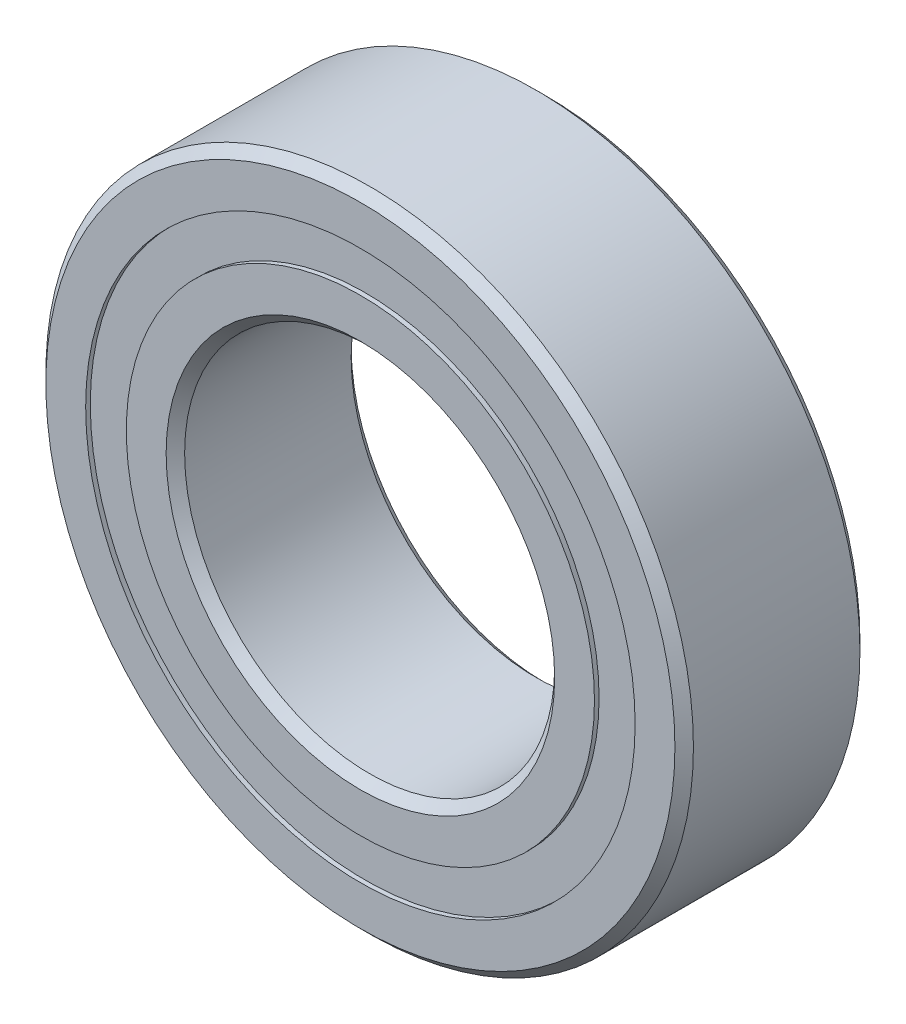
ISO-10303-21;
HEADER;
FILE_DESCRIPTION(('STEP AP214'),'2;1');
FILE_NAME('part.step','',(''),(''),'','','');
FILE_SCHEMA(('AUTOMOTIVE_DESIGN { 1 0 10303 214 1 1 1 1 }'));
ENDSEC;
DATA;
#1=APPLICATION_CONTEXT('core data for automotive mechanical design processes');
#2=APPLICATION_PROTOCOL_DEFINITION('international standard','automotive_design',2000,#1);
#3=PRODUCT_CONTEXT('',#1,'mechanical');
#4=PRODUCT('Part','Part','',(#3));
#5=PRODUCT_RELATED_PRODUCT_CATEGORY('part','',(#4));
#6=PRODUCT_DEFINITION_FORMATION('','',#4);
#7=PRODUCT_DEFINITION_CONTEXT('part definition',#1,'design');
#8=PRODUCT_DEFINITION('design','',#6,#7);
#9=PRODUCT_DEFINITION_SHAPE('','',#8);
#10=(LENGTH_UNIT() NAMED_UNIT(*) SI_UNIT(.MILLI.,.METRE.));
#11=(NAMED_UNIT(*) PLANE_ANGLE_UNIT() SI_UNIT($,.RADIAN.));
#12=(NAMED_UNIT(*) SI_UNIT($,.STERADIAN.) SOLID_ANGLE_UNIT());
#13=UNCERTAINTY_MEASURE_WITH_UNIT(LENGTH_MEASURE(1.E-05),#10,'distance_accuracy_value','');
#14=(GEOMETRIC_REPRESENTATION_CONTEXT(3) GLOBAL_UNCERTAINTY_ASSIGNED_CONTEXT((#13)) GLOBAL_UNIT_ASSIGNED_CONTEXT((#10,
#11,#12)) REPRESENTATION_CONTEXT('',''));
#15=CARTESIAN_POINT('',(0.,0.,0.));
#16=DIRECTION('',(0.,0.,1.));
#17=DIRECTION('',(1.,0.,0.));
#18=AXIS2_PLACEMENT_3D('',#15,#16,#17);
#19=CARTESIAN_POINT('',(0.,5.93956043956044,-1.9));
#20=DIRECTION('',(0.,0.,1.));
#21=DIRECTION('',(1.,0.,0.));
#22=AXIS2_PLACEMENT_3D('',#19,#20,#21);
#23=PLANE('',#22);
#24=CARTESIAN_POINT('',(0.,0.,-1.9));
#25=DIRECTION('',(0.,0.,1.));
#26=DIRECTION('',(1.,0.,0.));
#27=AXIS2_PLACEMENT_3D('',#24,#25,#26);
#28=CIRCLE('',#27,5.93956043956044);
#29=CARTESIAN_POINT('',(5.93956043956044,0.,-1.9));
#30=VERTEX_POINT('',#29);
#31=EDGE_CURVE('E57',#30,#30,#28,.T.);
#32=ORIENTED_EDGE('',*,*,#31,.F.);
#33=EDGE_LOOP('',(#32));
#34=FACE_BOUND('',#33,.T.);
#35=CARTESIAN_POINT('',(0.,0.,-1.9));
#36=DIRECTION('',(0.,0.,1.));
#37=DIRECTION('',(1.,0.,0.));
#38=AXIS2_PLACEMENT_3D('',#35,#36,#37);
#39=CIRCLE('',#38,5.06043956043956);
#40=CARTESIAN_POINT('',(5.06043956043956,0.,-1.9));
#41=VERTEX_POINT('',#40);
#42=EDGE_CURVE('E11',#41,#41,#39,.T.);
#43=ORIENTED_EDGE('',*,*,#42,.T.);
#44=EDGE_LOOP('',(#43));
#45=FACE_BOUND('',#44,.T.);
#46=ADVANCED_FACE('F43',(#34,#45),#23,.F.);
#47=CARTESIAN_POINT('',(0.,0.,2.));
#48=DIRECTION('',(0.,0.,1.));
#49=DIRECTION('',(1.,0.,0.));
#50=AXIS2_PLACEMENT_3D('',#47,#48,#49);
#51=CYLINDRICAL_SURFACE('',#50,5.06043956043956);
#52=ORIENTED_EDGE('',*,*,#42,.F.);
#53=EDGE_LOOP('',(#52));
#54=FACE_BOUND('',#53,.T.);
#55=CARTESIAN_POINT('',(0.,0.,-0.991633418565898));
#56=DIRECTION('',(0.,0.,1.));
#57=DIRECTION('',(1.,0.,0.));
#58=AXIS2_PLACEMENT_3D('',#55,#56,#57);
#59=CIRCLE('',#58,5.06043956043956);
#60=CARTESIAN_POINT('',(5.06043956043956,0.,-0.991633418565898));
#61=VERTEX_POINT('',#60);
#62=EDGE_CURVE('E49',#61,#61,#59,.T.);
#63=ORIENTED_EDGE('',*,*,#62,.T.);
#64=EDGE_LOOP('',(#63));
#65=FACE_BOUND('',#64,.T.);
#66=ADVANCED_FACE('F66',(#54,#65),#51,.F.);
#67=CARTESIAN_POINT('',(0.,5.93956043956044,-0.991633418565898));
#68=DIRECTION('',(0.,0.,-1.));
#69=DIRECTION('',(-1.,0.,0.));
#70=AXIS2_PLACEMENT_3D('',#67,#68,#69);
#71=PLANE('',#70);
#72=ORIENTED_EDGE('',*,*,#62,.F.);
#73=EDGE_LOOP('',(#72));
#74=FACE_BOUND('',#73,.T.);
#75=CARTESIAN_POINT('',(0.,0.,-0.991633418565898));
#76=DIRECTION('',(0.,0.,1.));
#77=DIRECTION('',(1.,0.,0.));
#78=AXIS2_PLACEMENT_3D('',#75,#76,#77);
#79=CIRCLE('',#78,5.93956043956044);
#80=CARTESIAN_POINT('',(5.93956043956044,0.,-0.991633418565898));
#81=VERTEX_POINT('',#80);
#82=EDGE_CURVE('E53',#81,#81,#79,.T.);
#83=ORIENTED_EDGE('',*,*,#82,.T.);
#84=EDGE_LOOP('',(#83));
#85=FACE_BOUND('',#84,.T.);
#86=ADVANCED_FACE('F70',(#74,#85),#71,.F.);
#87=CARTESIAN_POINT('',(0.,0.,2.));
#88=DIRECTION('',(0.,0.,1.));
#89=DIRECTION('',(1.,0.,0.));
#90=AXIS2_PLACEMENT_3D('',#87,#88,#89);
#91=CYLINDRICAL_SURFACE('',#90,5.93956043956044);
#92=ORIENTED_EDGE('',*,*,#82,.F.);
#93=EDGE_LOOP('',(#92));
#94=FACE_BOUND('',#93,.T.);
#95=ORIENTED_EDGE('',*,*,#31,.T.);
#96=EDGE_LOOP('',(#95));
#97=FACE_BOUND('',#96,.T.);
#98=ADVANCED_FACE('F63',(#94,#97),#91,.T.);
#99=CLOSED_SHELL('',(#46,#66,#86,#98));
#100=MANIFOLD_SOLID_BREP('B2',#99);
#101=CARTESIAN_POINT('',(0.,5.93956043956044,1.9));
#102=DIRECTION('',(0.,0.,-1.));
#103=DIRECTION('',(-1.,0.,0.));
#104=AXIS2_PLACEMENT_3D('',#101,#102,#103);
#105=PLANE('',#104);
#106=CARTESIAN_POINT('',(0.,0.,1.9));
#107=DIRECTION('',(0.,0.,1.));
#108=DIRECTION('',(1.,0.,0.));
#109=AXIS2_PLACEMENT_3D('',#106,#107,#108);
#110=CIRCLE('',#109,5.06043956043956);
#111=CARTESIAN_POINT('',(5.06043956043956,0.,1.9));
#112=VERTEX_POINT('',#111);
#113=EDGE_CURVE('E42',#112,#112,#110,.T.);
#114=ORIENTED_EDGE('',*,*,#113,.F.);
#115=EDGE_LOOP('',(#114));
#116=FACE_BOUND('',#115,.T.);
#117=CARTESIAN_POINT('',(0.,0.,1.9));
#118=DIRECTION('',(0.,0.,1.));
#119=DIRECTION('',(1.,0.,0.));
#120=AXIS2_PLACEMENT_3D('',#117,#118,#119);
#121=CIRCLE('',#120,5.93956043956044);
#122=CARTESIAN_POINT('',(5.93956043956044,0.,1.9));
#123=VERTEX_POINT('',#122);
#124=EDGE_CURVE('E130',#123,#123,#121,.T.);
#125=ORIENTED_EDGE('',*,*,#124,.T.);
#126=EDGE_LOOP('',(#125));
#127=FACE_BOUND('',#126,.T.);
#128=ADVANCED_FACE('F116',(#116,#127),#105,.F.);
#129=CARTESIAN_POINT('',(0.,0.,2.));
#130=DIRECTION('',(0.,0.,1.));
#131=DIRECTION('',(1.,0.,0.));
#132=AXIS2_PLACEMENT_3D('',#129,#130,#131);
#133=CYLINDRICAL_SURFACE('',#132,5.06043956043956);
#134=CARTESIAN_POINT('',(0.,0.,0.991633418565898));
#135=DIRECTION('',(0.,0.,1.));
#136=DIRECTION('',(1.,0.,0.));
#137=AXIS2_PLACEMENT_3D('',#134,#135,#136);
#138=CIRCLE('',#137,5.06043956043956);
#139=CARTESIAN_POINT('',(5.06043956043956,0.,0.991633418565898));
#140=VERTEX_POINT('',#139);
#141=EDGE_CURVE('E122',#140,#140,#138,.T.);
#142=ORIENTED_EDGE('',*,*,#141,.F.);
#143=EDGE_LOOP('',(#142));
#144=FACE_BOUND('',#143,.T.);
#145=ORIENTED_EDGE('',*,*,#113,.T.);
#146=EDGE_LOOP('',(#145));
#147=FACE_BOUND('',#146,.T.);
#148=ADVANCED_FACE('F145',(#144,#147),#133,.F.);
#149=CARTESIAN_POINT('',(0.,5.93956043956044,0.991633418565898));
#150=DIRECTION('',(0.,0.,1.));
#151=DIRECTION('',(1.,0.,0.));
#152=AXIS2_PLACEMENT_3D('',#149,#150,#151);
#153=PLANE('',#152);
#154=CARTESIAN_POINT('',(0.,0.,0.991633418565898));
#155=DIRECTION('',(0.,0.,1.));
#156=DIRECTION('',(1.,0.,0.));
#157=AXIS2_PLACEMENT_3D('',#154,#155,#156);
#158=CIRCLE('',#157,5.93956043956044);
#159=CARTESIAN_POINT('',(5.93956043956044,0.,0.991633418565898));
#160=VERTEX_POINT('',#159);
#161=EDGE_CURVE('E126',#160,#160,#158,.T.);
#162=ORIENTED_EDGE('',*,*,#161,.F.);
#163=EDGE_LOOP('',(#162));
#164=FACE_BOUND('',#163,.T.);
#165=ORIENTED_EDGE('',*,*,#141,.T.);
#166=EDGE_LOOP('',(#165));
#167=FACE_BOUND('',#166,.T.);
#168=ADVANCED_FACE('F140',(#164,#167),#153,.F.);
#169=CARTESIAN_POINT('',(0.,0.,2.));
#170=DIRECTION('',(0.,0.,1.));
#171=DIRECTION('',(1.,0.,0.));
#172=AXIS2_PLACEMENT_3D('',#169,#170,#171);
#173=CYLINDRICAL_SURFACE('',#172,5.93956043956044);
#174=ORIENTED_EDGE('',*,*,#124,.F.);
#175=EDGE_LOOP('',(#174));
#176=FACE_BOUND('',#175,.T.);
#177=ORIENTED_EDGE('',*,*,#161,.T.);
#178=EDGE_LOOP('',(#177));
#179=FACE_BOUND('',#178,.T.);
#180=ADVANCED_FACE('F137',(#176,#179),#173,.T.);
#181=CLOSED_SHELL('',(#128,#148,#168,#180));
#182=MANIFOLD_SOLID_BREP('B6',#181);
#183=CARTESIAN_POINT('',(-2.74999999999994,4.76313972081445,0.));
#184=DIRECTION('',(0.,0.,1.));
#185=DIRECTION('',(-0.499999999999989,0.866025403784445,0.));
#186=AXIS2_PLACEMENT_3D('',#183,#184,#185);
#187=SPHERICAL_SURFACE('',#186,0.991633418565898);
#188=CARTESIAN_POINT('',(-2.74999999999994,4.76313972081445,0.991633418565898));
#189=VERTEX_POINT('',#188);
#190=VERTEX_LOOP('',#189);
#191=FACE_BOUND('',#190,.T.);
#192=ADVANCED_FACE('F184',(#191),#187,.T.);
#193=CLOSED_SHELL('',(#192));
#194=MANIFOLD_SOLID_BREP('B37',#193);
#195=CARTESIAN_POINT('',(-4.76313972081438,2.75000000000006,0.));
#196=DIRECTION('',(0.,0.,1.));
#197=DIRECTION('',(-0.866025403784433,0.50000000000001,0.));
#198=AXIS2_PLACEMENT_3D('',#195,#196,#197);
#199=SPHERICAL_SURFACE('',#198,0.991633418565898);
#200=CARTESIAN_POINT('',(-4.76313972081438,2.75000000000006,0.991633418565898));
#201=VERTEX_POINT('',#200);
#202=VERTEX_LOOP('',#201);
#203=FACE_BOUND('',#202,.T.);
#204=ADVANCED_FACE('F206',(#203),#199,.T.);
#205=CLOSED_SHELL('',(#204));
#206=MANIFOLD_SOLID_BREP('B112',#205);
#207=CARTESIAN_POINT('',(-5.5,0.,0.));
#208=DIRECTION('',(0.,0.,1.));
#209=DIRECTION('',(-1.,0.,0.));
#210=AXIS2_PLACEMENT_3D('',#207,#208,#209);
#211=SPHERICAL_SURFACE('',#210,0.991633418565898);
#212=CARTESIAN_POINT('',(-5.5,0.,0.991633418565898));
#213=VERTEX_POINT('',#212);
#214=VERTEX_LOOP('',#213);
#215=FACE_BOUND('',#214,.T.);
#216=ADVANCED_FACE('F227',(#215),#211,.T.);
#217=CLOSED_SHELL('',(#216));
#218=MANIFOLD_SOLID_BREP('B180',#217);
#219=CARTESIAN_POINT('',(-4.76313972081444,-2.74999999999996,0.));
#220=DIRECTION('',(0.,0.,1.));
#221=DIRECTION('',(-0.866025403784443,-0.499999999999992,0.));
#222=AXIS2_PLACEMENT_3D('',#219,#220,#221);
#223=SPHERICAL_SURFACE('',#222,0.991633418565898);
#224=CARTESIAN_POINT('',(-4.76313972081444,-2.74999999999996,0.991633418565898));
#225=VERTEX_POINT('',#224);
#226=VERTEX_LOOP('',#225);
#227=FACE_BOUND('',#226,.T.);
#228=ADVANCED_FACE('F245',(#227),#223,.T.);
#229=CLOSED_SHELL('',(#228));
#230=MANIFOLD_SOLID_BREP('B202',#229);
#231=CARTESIAN_POINT('',(-2.75000000000004,-4.76313972081439,0.));
#232=DIRECTION('',(0.,0.,1.));
#233=DIRECTION('',(-0.500000000000007,-0.866025403784435,0.));
#234=AXIS2_PLACEMENT_3D('',#231,#232,#233);
#235=SPHERICAL_SURFACE('',#234,0.991633418565898);
#236=CARTESIAN_POINT('',(-2.75000000000004,-4.76313972081439,0.991633418565898));
#237=VERTEX_POINT('',#236);
#238=VERTEX_LOOP('',#237);
#239=FACE_BOUND('',#238,.T.);
#240=ADVANCED_FACE('F263',(#239),#235,.T.);
#241=CLOSED_SHELL('',(#240));
#242=MANIFOLD_SOLID_BREP('B223',#241);
#243=CARTESIAN_POINT('',(0.,-5.5,0.));
#244=DIRECTION('',(0.,0.,1.));
#245=DIRECTION('',(0.,-1.,0.));
#246=AXIS2_PLACEMENT_3D('',#243,#244,#245);
#247=SPHERICAL_SURFACE('',#246,0.991633418565898);
#248=CARTESIAN_POINT('',(0.,-5.5,0.991633418565898));
#249=VERTEX_POINT('',#248);
#250=VERTEX_LOOP('',#249);
#251=FACE_BOUND('',#250,.T.);
#252=ADVANCED_FACE('F281',(#251),#247,.T.);
#253=CLOSED_SHELL('',(#252));
#254=MANIFOLD_SOLID_BREP('B241',#253);
#255=CARTESIAN_POINT('',(2.74999999999997,-4.76313972081443,0.));
#256=DIRECTION('',(0.,0.,1.));
#257=DIRECTION('',(0.499999999999995,-0.866025403784442,0.));
#258=AXIS2_PLACEMENT_3D('',#255,#256,#257);
#259=SPHERICAL_SURFACE('',#258,0.991633418565898);
#260=CARTESIAN_POINT('',(2.74999999999997,-4.76313972081443,0.991633418565898));
#261=VERTEX_POINT('',#260);
#262=VERTEX_LOOP('',#261);
#263=FACE_BOUND('',#262,.T.);
#264=ADVANCED_FACE('F300',(#263),#259,.T.);
#265=CLOSED_SHELL('',(#264));
#266=MANIFOLD_SOLID_BREP('B259',#265);
#267=CARTESIAN_POINT('',(4.7631397208144,-2.75000000000002,0.));
#268=DIRECTION('',(0.,0.,1.));
#269=DIRECTION('',(0.866025403784436,-0.500000000000004,0.));
#270=AXIS2_PLACEMENT_3D('',#267,#268,#269);
#271=SPHERICAL_SURFACE('',#270,0.991633418565898);
#272=CARTESIAN_POINT('',(4.7631397208144,-2.75000000000002,0.991633418565898));
#273=VERTEX_POINT('',#272);
#274=VERTEX_LOOP('',#273);
#275=FACE_BOUND('',#274,.T.);
#276=ADVANCED_FACE('F321',(#275),#271,.T.);
#277=CLOSED_SHELL('',(#276));
#278=MANIFOLD_SOLID_BREP('B277',#277);
#279=CARTESIAN_POINT('',(5.5,0.,0.));
#280=DIRECTION('',(0.,0.,1.));
#281=DIRECTION('',(1.,0.,0.));
#282=AXIS2_PLACEMENT_3D('',#279,#280,#281);
#283=SPHERICAL_SURFACE('',#282,0.991633418565898);
#284=CARTESIAN_POINT('',(5.5,0.,0.991633418565898));
#285=VERTEX_POINT('',#284);
#286=VERTEX_LOOP('',#285);
#287=FACE_BOUND('',#286,.T.);
#288=ADVANCED_FACE('F340',(#287),#283,.T.);
#289=CLOSED_SHELL('',(#288));
#290=MANIFOLD_SOLID_BREP('B296',#289);
#291=CARTESIAN_POINT('',(4.76313972081442,2.74999999999999,0.));
#292=DIRECTION('',(0.,0.,1.));
#293=DIRECTION('',(0.86602540378444,0.499999999999998,0.));
#294=AXIS2_PLACEMENT_3D('',#291,#292,#293);
#295=SPHERICAL_SURFACE('',#294,0.991633418565898);
#296=CARTESIAN_POINT('',(4.76313972081442,2.74999999999999,0.991633418565898));
#297=VERTEX_POINT('',#296);
#298=VERTEX_LOOP('',#297);
#299=FACE_BOUND('',#298,.T.);
#300=ADVANCED_FACE('F361',(#299),#295,.T.);
#301=CLOSED_SHELL('',(#300));
#302=MANIFOLD_SOLID_BREP('B317',#301);
#303=CARTESIAN_POINT('',(2.75000000000001,4.76313972081441,0.));
#304=DIRECTION('',(0.,0.,1.));
#305=DIRECTION('',(0.500000000000001,0.866025403784438,0.));
#306=AXIS2_PLACEMENT_3D('',#303,#304,#305);
#307=SPHERICAL_SURFACE('',#306,0.991633418565898);
#308=CARTESIAN_POINT('',(2.75000000000001,4.76313972081441,0.991633418565898));
#309=VERTEX_POINT('',#308);
#310=VERTEX_LOOP('',#309);
#311=FACE_BOUND('',#310,.T.);
#312=ADVANCED_FACE('F379',(#311),#307,.T.);
#313=CLOSED_SHELL('',(#312));
#314=MANIFOLD_SOLID_BREP('B336',#313);
#315=CARTESIAN_POINT('',(0.,5.5,0.));
#316=DIRECTION('',(0.,0.,1.));
#317=DIRECTION('',(0.,1.,0.));
#318=AXIS2_PLACEMENT_3D('',#315,#316,#317);
#319=SPHERICAL_SURFACE('',#318,0.991633418565898);
#320=CARTESIAN_POINT('',(0.,5.5,0.991633418565898));
#321=VERTEX_POINT('',#320);
#322=VERTEX_LOOP('',#321);
#323=FACE_BOUND('',#322,.T.);
#324=ADVANCED_FACE('F400',(#323),#319,.T.);
#325=CLOSED_SHELL('',(#324));
#326=MANIFOLD_SOLID_BREP('B357',#325);
#327=CARTESIAN_POINT('',(0.,5.06043956043956,2.));
#328=DIRECTION('',(0.,0.,-1.));
#329=DIRECTION('',(-1.,0.,0.));
#330=AXIS2_PLACEMENT_3D('',#327,#328,#329);
#331=PLANE('',#330);
#332=CARTESIAN_POINT('',(0.,0.,2.));
#333=DIRECTION('',(0.,0.,1.));
#334=DIRECTION('',(1.,0.,0.));
#335=AXIS2_PLACEMENT_3D('',#332,#333,#334);
#336=CIRCLE('',#335,4.2);
#337=CARTESIAN_POINT('',(4.2,0.,2.));
#338=VERTEX_POINT('',#337);
#339=EDGE_CURVE('E452',#338,#338,#336,.T.);
#340=ORIENTED_EDGE('',*,*,#339,.F.);
#341=EDGE_LOOP('',(#340));
#342=FACE_BOUND('',#341,.T.);
#343=CARTESIAN_POINT('',(0.,0.,2.));
#344=DIRECTION('',(0.,0.,1.));
#345=DIRECTION('',(1.,0.,0.));
#346=AXIS2_PLACEMENT_3D('',#343,#344,#345);
#347=CIRCLE('',#346,5.06043956043956);
#348=CARTESIAN_POINT('',(5.06043956043956,0.,2.));
#349=VERTEX_POINT('',#348);
#350=EDGE_CURVE('E399',#349,#349,#347,.T.);
#351=ORIENTED_EDGE('',*,*,#350,.T.);
#352=EDGE_LOOP('',(#351));
#353=FACE_BOUND('',#352,.T.);
#354=ADVANCED_FACE('F424',(#342,#353),#331,.F.);
#355=CARTESIAN_POINT('',(0.,0.,2.));
#356=DIRECTION('',(0.,0.,1.));
#357=DIRECTION('',(1.,0.,0.));
#358=AXIS2_PLACEMENT_3D('',#355,#356,#357);
#359=CYLINDRICAL_SURFACE('',#358,5.06043956043956);
#360=ORIENTED_EDGE('',*,*,#350,.F.);
#361=EDGE_LOOP('',(#360));
#362=FACE_BOUND('',#361,.T.);
#363=CARTESIAN_POINT('',(0.,0.,0.888888888888889));
#364=DIRECTION('',(0.,0.,1.));
#365=DIRECTION('',(1.,0.,0.));
#366=AXIS2_PLACEMENT_3D('',#363,#364,#365);
#367=CIRCLE('',#366,5.06043956043956);
#368=CARTESIAN_POINT('',(5.06043956043956,0.,0.888888888888889));
#369=VERTEX_POINT('',#368);
#370=EDGE_CURVE('E430',#369,#369,#367,.T.);
#371=ORIENTED_EDGE('',*,*,#370,.T.);
#372=EDGE_LOOP('',(#371));
#373=FACE_BOUND('',#372,.T.);
#374=ADVANCED_FACE('F459',(#362,#373),#359,.T.);
#375=CARTESIAN_POINT('',(0.,0.,0.));
#376=DIRECTION('',(0.,0.,1.));
#377=DIRECTION('',(1.,0.,0.));
#378=AXIS2_PLACEMENT_3D('',#375,#376,#377);
#379=TOROIDAL_SURFACE('',#378,5.5,0.991633418565897);
#380=ORIENTED_EDGE('',*,*,#370,.F.);
#381=EDGE_LOOP('',(#380));
#382=FACE_BOUND('',#381,.T.);
#383=CARTESIAN_POINT('',(0.,0.,-0.88888888888889));
#384=DIRECTION('',(0.,0.,1.));
#385=DIRECTION('',(1.,0.,0.));
#386=AXIS2_PLACEMENT_3D('',#383,#384,#385);
#387=CIRCLE('',#386,5.06043956043956);
#388=CARTESIAN_POINT('',(5.06043956043956,0.,-0.88888888888889));
#389=VERTEX_POINT('',#388);
#390=EDGE_CURVE('E434',#389,#389,#387,.T.);
#391=ORIENTED_EDGE('',*,*,#390,.T.);
#392=EDGE_LOOP('',(#391));
#393=FACE_BOUND('',#392,.T.);
#394=ADVANCED_FACE('F463',(#382,#393),#379,.F.);
#395=CARTESIAN_POINT('',(0.,0.,2.));
#396=DIRECTION('',(0.,0.,1.));
#397=DIRECTION('',(1.,0.,0.));
#398=AXIS2_PLACEMENT_3D('',#395,#396,#397);
#399=CYLINDRICAL_SURFACE('',#398,5.06043956043956);
#400=ORIENTED_EDGE('',*,*,#390,.F.);
#401=EDGE_LOOP('',(#400));
#402=FACE_BOUND('',#401,.T.);
#403=CARTESIAN_POINT('',(0.,0.,-2.));
#404=DIRECTION('',(0.,0.,1.));
#405=DIRECTION('',(1.,0.,0.));
#406=AXIS2_PLACEMENT_3D('',#403,#404,#405);
#407=CIRCLE('',#406,5.06043956043956);
#408=CARTESIAN_POINT('',(5.06043956043956,0.,-2.));
#409=VERTEX_POINT('',#408);
#410=EDGE_CURVE('E438',#409,#409,#407,.T.);
#411=ORIENTED_EDGE('',*,*,#410,.T.);
#412=EDGE_LOOP('',(#411));
#413=FACE_BOUND('',#412,.T.);
#414=ADVANCED_FACE('F468',(#402,#413),#399,.T.);
#415=CARTESIAN_POINT('',(0.,4.2,-2.));
#416=DIRECTION('',(0.,0.,1.));
#417=DIRECTION('',(1.,0.,0.));
#418=AXIS2_PLACEMENT_3D('',#415,#416,#417);
#419=PLANE('',#418);
#420=ORIENTED_EDGE('',*,*,#410,.F.);
#421=EDGE_LOOP('',(#420));
#422=FACE_BOUND('',#421,.T.);
#423=CARTESIAN_POINT('',(0.,0.,-2.));
#424=DIRECTION('',(0.,0.,1.));
#425=DIRECTION('',(1.,0.,0.));
#426=AXIS2_PLACEMENT_3D('',#423,#424,#425);
#427=CIRCLE('',#426,4.2);
#428=CARTESIAN_POINT('',(4.2,0.,-2.));
#429=VERTEX_POINT('',#428);
#430=EDGE_CURVE('E443',#429,#429,#427,.T.);
#431=ORIENTED_EDGE('',*,*,#430,.T.);
#432=EDGE_LOOP('',(#431));
#433=FACE_BOUND('',#432,.T.);
#434=ADVANCED_FACE('F474',(#422,#433),#419,.F.);
#435=CARTESIAN_POINT('',(0.,0.,-1.8));
#436=DIRECTION('',(0.,0.,-1.));
#437=DIRECTION('',(-1.,0.,0.));
#438=AXIS2_PLACEMENT_3D('',#435,#436,#437);
#439=CONICAL_SURFACE('',#438,4.,0.78539816339745);
#440=ORIENTED_EDGE('',*,*,#430,.F.);
#441=EDGE_LOOP('',(#440));
#442=FACE_BOUND('',#441,.T.);
#443=CARTESIAN_POINT('',(0.,0.,-1.8));
#444=DIRECTION('',(0.,0.,1.));
#445=DIRECTION('',(1.,0.,0.));
#446=AXIS2_PLACEMENT_3D('',#443,#444,#445);
#447=CIRCLE('',#446,4.);
#448=CARTESIAN_POINT('',(4.,0.,-1.8));
#449=VERTEX_POINT('',#448);
#450=EDGE_CURVE('E446',#449,#449,#447,.T.);
#451=ORIENTED_EDGE('',*,*,#450,.T.);
#452=EDGE_LOOP('',(#451));
#453=FACE_BOUND('',#452,.T.);
#454=ADVANCED_FACE('F478',(#442,#453),#439,.F.);
#455=CARTESIAN_POINT('',(0.,0.,2.));
#456=DIRECTION('',(0.,0.,1.));
#457=DIRECTION('',(1.,0.,0.));
#458=AXIS2_PLACEMENT_3D('',#455,#456,#457);
#459=CYLINDRICAL_SURFACE('',#458,4.);
#460=ORIENTED_EDGE('',*,*,#450,.F.);
#461=EDGE_LOOP('',(#460));
#462=FACE_BOUND('',#461,.T.);
#463=CARTESIAN_POINT('',(0.,0.,1.8));
#464=DIRECTION('',(0.,0.,1.));
#465=DIRECTION('',(1.,0.,0.));
#466=AXIS2_PLACEMENT_3D('',#463,#464,#465);
#467=CIRCLE('',#466,4.);
#468=CARTESIAN_POINT('',(4.,0.,1.8));
#469=VERTEX_POINT('',#468);
#470=EDGE_CURVE('E449',#469,#469,#467,.T.);
#471=ORIENTED_EDGE('',*,*,#470,.T.);
#472=EDGE_LOOP('',(#471));
#473=FACE_BOUND('',#472,.T.);
#474=ADVANCED_FACE('F482',(#462,#473),#459,.F.);
#475=CARTESIAN_POINT('',(0.,0.,2.));
#476=DIRECTION('',(0.,0.,1.));
#477=DIRECTION('',(1.,0.,0.));
#478=AXIS2_PLACEMENT_3D('',#475,#476,#477);
#479=CONICAL_SURFACE('',#478,4.2,0.785398163397446);
#480=ORIENTED_EDGE('',*,*,#470,.F.);
#481=EDGE_LOOP('',(#480));
#482=FACE_BOUND('',#481,.T.);
#483=ORIENTED_EDGE('',*,*,#339,.T.);
#484=EDGE_LOOP('',(#483));
#485=FACE_BOUND('',#484,.T.);
#486=ADVANCED_FACE('F456',(#482,#485),#479,.F.);
#487=CLOSED_SHELL('',(#354,#374,#394,#414,#434,#454,#474,#486));
#488=MANIFOLD_SOLID_BREP('B375',#487);
#489=CARTESIAN_POINT('',(0.,0.,1.8));
#490=DIRECTION('',(0.,0.,-1.));
#491=DIRECTION('',(-1.,0.,0.));
#492=AXIS2_PLACEMENT_3D('',#489,#490,#491);
#493=CONICAL_SURFACE('',#492,7.,0.785398163397449);
#494=CARTESIAN_POINT('',(0.,0.,2.));
#495=DIRECTION('',(0.,0.,1.));
#496=DIRECTION('',(1.,0.,0.));
#497=AXIS2_PLACEMENT_3D('',#494,#495,#496);
#498=CIRCLE('',#497,6.8);
#499=CARTESIAN_POINT('',(6.8,0.,2.));
#500=VERTEX_POINT('',#499);
#501=EDGE_CURVE('E579',#500,#500,#498,.T.);
#502=ORIENTED_EDGE('',*,*,#501,.F.);
#503=EDGE_LOOP('',(#502));
#504=FACE_BOUND('',#503,.T.);
#505=CARTESIAN_POINT('',(0.,0.,1.8));
#506=DIRECTION('',(0.,0.,1.));
#507=DIRECTION('',(1.,0.,0.));
#508=AXIS2_PLACEMENT_3D('',#505,#506,#507);
#509=CIRCLE('',#508,7.);
#510=CARTESIAN_POINT('',(7.,0.,1.8));
#511=VERTEX_POINT('',#510);
#512=EDGE_CURVE('E423',#511,#511,#509,.T.);
#513=ORIENTED_EDGE('',*,*,#512,.T.);
#514=EDGE_LOOP('',(#513));
#515=FACE_BOUND('',#514,.T.);
#516=ADVANCED_FACE('F551',(#504,#515),#493,.T.);
#517=CARTESIAN_POINT('',(0.,0.,2.));
#518=DIRECTION('',(0.,0.,1.));
#519=DIRECTION('',(1.,0.,0.));
#520=AXIS2_PLACEMENT_3D('',#517,#518,#519);
#521=CYLINDRICAL_SURFACE('',#520,7.);
#522=ORIENTED_EDGE('',*,*,#512,.F.);
#523=EDGE_LOOP('',(#522));
#524=FACE_BOUND('',#523,.T.);
#525=CARTESIAN_POINT('',(0.,0.,-1.8));
#526=DIRECTION('',(0.,0.,1.));
#527=DIRECTION('',(1.,0.,0.));
#528=AXIS2_PLACEMENT_3D('',#525,#526,#527);
#529=CIRCLE('',#528,7.);
#530=CARTESIAN_POINT('',(7.,0.,-1.8));
#531=VERTEX_POINT('',#530);
#532=EDGE_CURVE('E557',#531,#531,#529,.T.);
#533=ORIENTED_EDGE('',*,*,#532,.T.);
#534=EDGE_LOOP('',(#533));
#535=FACE_BOUND('',#534,.T.);
#536=ADVANCED_FACE('F586',(#524,#535),#521,.T.);
#537=CARTESIAN_POINT('',(0.,0.,-2.));
#538=DIRECTION('',(0.,0.,1.));
#539=DIRECTION('',(1.,0.,0.));
#540=AXIS2_PLACEMENT_3D('',#537,#538,#539);
#541=CONICAL_SURFACE('',#540,6.8,0.78539816339745);
#542=ORIENTED_EDGE('',*,*,#532,.F.);
#543=EDGE_LOOP('',(#542));
#544=FACE_BOUND('',#543,.T.);
#545=CARTESIAN_POINT('',(0.,0.,-2.));
#546=DIRECTION('',(0.,0.,1.));
#547=DIRECTION('',(1.,0.,0.));
#548=AXIS2_PLACEMENT_3D('',#545,#546,#547);
#549=CIRCLE('',#548,6.8);
#550=CARTESIAN_POINT('',(6.8,0.,-2.));
#551=VERTEX_POINT('',#550);
#552=EDGE_CURVE('E561',#551,#551,#549,.T.);
#553=ORIENTED_EDGE('',*,*,#552,.T.);
#554=EDGE_LOOP('',(#553));
#555=FACE_BOUND('',#554,.T.);
#556=ADVANCED_FACE('F590',(#544,#555),#541,.T.);
#557=CARTESIAN_POINT('',(0.,6.8,-2.));
#558=DIRECTION('',(0.,0.,1.));
#559=DIRECTION('',(1.,0.,0.));
#560=AXIS2_PLACEMENT_3D('',#557,#558,#559);
#561=PLANE('',#560);
#562=ORIENTED_EDGE('',*,*,#552,.F.);
#563=EDGE_LOOP('',(#562));
#564=FACE_BOUND('',#563,.T.);
#565=CARTESIAN_POINT('',(0.,0.,-2.));
#566=DIRECTION('',(0.,0.,1.));
#567=DIRECTION('',(1.,0.,0.));
#568=AXIS2_PLACEMENT_3D('',#565,#566,#567);
#569=CIRCLE('',#568,5.93956043956044);
#570=CARTESIAN_POINT('',(5.93956043956044,0.,-2.));
#571=VERTEX_POINT('',#570);
#572=EDGE_CURVE('E565',#571,#571,#569,.T.);
#573=ORIENTED_EDGE('',*,*,#572,.T.);
#574=EDGE_LOOP('',(#573));
#575=FACE_BOUND('',#574,.T.);
#576=ADVANCED_FACE('F595',(#564,#575),#561,.F.);
#577=CARTESIAN_POINT('',(0.,0.,2.));
#578=DIRECTION('',(0.,0.,1.));
#579=DIRECTION('',(1.,0.,0.));
#580=AXIS2_PLACEMENT_3D('',#577,#578,#579);
#581=CYLINDRICAL_SURFACE('',#580,5.93956043956044);
#582=ORIENTED_EDGE('',*,*,#572,.F.);
#583=EDGE_LOOP('',(#582));
#584=FACE_BOUND('',#583,.T.);
#585=CARTESIAN_POINT('',(0.,0.,-0.888888888888889));
#586=DIRECTION('',(0.,0.,1.));
#587=DIRECTION('',(1.,0.,0.));
#588=AXIS2_PLACEMENT_3D('',#585,#586,#587);
#589=CIRCLE('',#588,5.93956043956044);
#590=CARTESIAN_POINT('',(5.93956043956044,0.,-0.888888888888889));
#591=VERTEX_POINT('',#590);
#592=EDGE_CURVE('E570',#591,#591,#589,.T.);
#593=ORIENTED_EDGE('',*,*,#592,.T.);
#594=EDGE_LOOP('',(#593));
#595=FACE_BOUND('',#594,.T.);
#596=ADVANCED_FACE('F601',(#584,#595),#581,.F.);
#597=CARTESIAN_POINT('',(0.,0.,0.));
#598=DIRECTION('',(0.,0.,1.));
#599=DIRECTION('',(1.,0.,0.));
#600=AXIS2_PLACEMENT_3D('',#597,#598,#599);
#601=TOROIDAL_SURFACE('',#600,5.5,0.991633418565898);
#602=ORIENTED_EDGE('',*,*,#592,.F.);
#603=EDGE_LOOP('',(#602));
#604=FACE_BOUND('',#603,.T.);
#605=CARTESIAN_POINT('',(0.,0.,0.888888888888889));
#606=DIRECTION('',(0.,0.,1.));
#607=DIRECTION('',(1.,0.,0.));
#608=AXIS2_PLACEMENT_3D('',#605,#606,#607);
#609=CIRCLE('',#608,5.93956043956044);
#610=CARTESIAN_POINT('',(5.93956043956044,0.,0.888888888888889));
#611=VERTEX_POINT('',#610);
#612=EDGE_CURVE('E573',#611,#611,#609,.T.);
#613=ORIENTED_EDGE('',*,*,#612,.T.);
#614=EDGE_LOOP('',(#613));
#615=FACE_BOUND('',#614,.T.);
#616=ADVANCED_FACE('F605',(#604,#615),#601,.F.);
#617=CARTESIAN_POINT('',(0.,0.,2.));
#618=DIRECTION('',(0.,0.,1.));
#619=DIRECTION('',(1.,0.,0.));
#620=AXIS2_PLACEMENT_3D('',#617,#618,#619);
#621=CYLINDRICAL_SURFACE('',#620,5.93956043956044);
#622=ORIENTED_EDGE('',*,*,#612,.F.);
#623=EDGE_LOOP('',(#622));
#624=FACE_BOUND('',#623,.T.);
#625=CARTESIAN_POINT('',(0.,0.,2.));
#626=DIRECTION('',(0.,0.,1.));
#627=DIRECTION('',(1.,0.,0.));
#628=AXIS2_PLACEMENT_3D('',#625,#626,#627);
#629=CIRCLE('',#628,5.93956043956044);
#630=CARTESIAN_POINT('',(5.93956043956044,0.,2.));
#631=VERTEX_POINT('',#630);
#632=EDGE_CURVE('E576',#631,#631,#629,.T.);
#633=ORIENTED_EDGE('',*,*,#632,.T.);
#634=EDGE_LOOP('',(#633));
#635=FACE_BOUND('',#634,.T.);
#636=ADVANCED_FACE('F609',(#624,#635),#621,.F.);
#637=CARTESIAN_POINT('',(0.,6.8,2.));
#638=DIRECTION('',(0.,0.,-1.));
#639=DIRECTION('',(-1.,0.,0.));
#640=AXIS2_PLACEMENT_3D('',#637,#638,#639);
#641=PLANE('',#640);
#642=ORIENTED_EDGE('',*,*,#632,.F.);
#643=EDGE_LOOP('',(#642));
#644=FACE_BOUND('',#643,.T.);
#645=ORIENTED_EDGE('',*,*,#501,.T.);
#646=EDGE_LOOP('',(#645));
#647=FACE_BOUND('',#646,.T.);
#648=ADVANCED_FACE('F583',(#644,#647),#641,.F.);
#649=CLOSED_SHELL('',(#516,#536,#556,#576,#596,#616,#636,#648));
#650=MANIFOLD_SOLID_BREP('B394',#649);
#651=ADVANCED_BREP_SHAPE_REPRESENTATION('',(#18,#100,#182,#194,#206,#218,#230,#242,#254,#266,
#278,#290,#302,#314,#326,#488,#650),#14);
#652=SHAPE_DEFINITION_REPRESENTATION(#9,#651);
ENDSEC;
END-ISO-10303-21;
